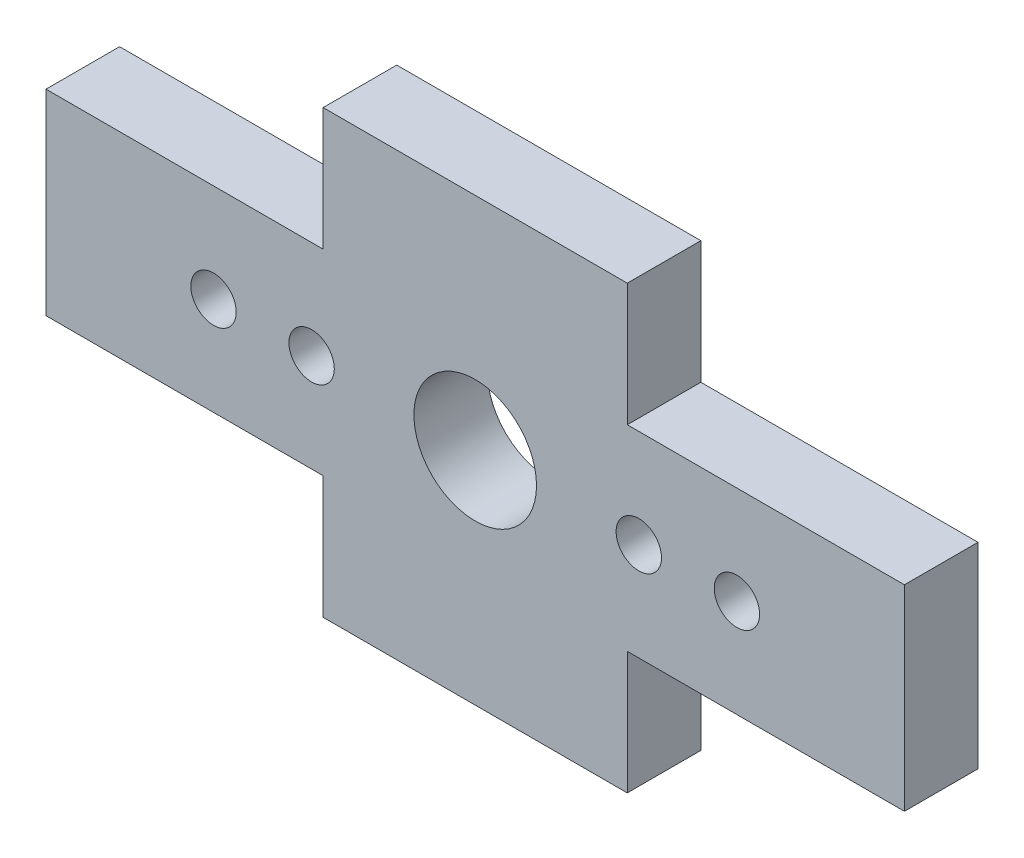
ISO-10303-21;
HEADER;
FILE_DESCRIPTION(('STEP AP214'),'2;1');
FILE_NAME('part.step','',(''),(''),'','','');
FILE_SCHEMA(('AUTOMOTIVE_DESIGN { 1 0 10303 214 1 1 1 1 }'));
ENDSEC;
DATA;
#1=APPLICATION_CONTEXT('core data for automotive mechanical design processes');
#2=APPLICATION_PROTOCOL_DEFINITION('international standard','automotive_design',2000,#1);
#3=PRODUCT_CONTEXT('',#1,'mechanical');
#4=PRODUCT('Part','Part','',(#3));
#5=PRODUCT_RELATED_PRODUCT_CATEGORY('part','',(#4));
#6=PRODUCT_DEFINITION_FORMATION('','',#4);
#7=PRODUCT_DEFINITION_CONTEXT('part definition',#1,'design');
#8=PRODUCT_DEFINITION('design','',#6,#7);
#9=PRODUCT_DEFINITION_SHAPE('','',#8);
#10=(LENGTH_UNIT() NAMED_UNIT(*) SI_UNIT(.MILLI.,.METRE.));
#11=(NAMED_UNIT(*) PLANE_ANGLE_UNIT() SI_UNIT($,.RADIAN.));
#12=(NAMED_UNIT(*) SI_UNIT($,.STERADIAN.) SOLID_ANGLE_UNIT());
#13=UNCERTAINTY_MEASURE_WITH_UNIT(LENGTH_MEASURE(1.E-05),#10,'distance_accuracy_value','');
#14=(GEOMETRIC_REPRESENTATION_CONTEXT(3) GLOBAL_UNCERTAINTY_ASSIGNED_CONTEXT((#13)) GLOBAL_UNIT_ASSIGNED_CONTEXT((#10,
#11,#12)) REPRESENTATION_CONTEXT('',''));
#15=CARTESIAN_POINT('',(0.,0.,0.));
#16=DIRECTION('',(0.,0.,1.));
#17=DIRECTION('',(1.,0.,0.));
#18=AXIS2_PLACEMENT_3D('',#15,#16,#17);
#19=CARTESIAN_POINT('',(0.,0.,3.));
#20=DIRECTION('',(0.,0.,1.));
#21=DIRECTION('',(1.,0.,0.));
#22=AXIS2_PLACEMENT_3D('',#19,#20,#21);
#23=PLANE('',#22);
#24=CARTESIAN_POINT('',(-6.66999999999978,0.,3.));
#25=DIRECTION('',(0.,0.,1.));
#26=DIRECTION('',(1.,0.,0.));
#27=AXIS2_PLACEMENT_3D('',#24,#25,#26);
#28=CIRCLE('',#27,0.925000000000065);
#29=CARTESIAN_POINT('',(-5.74499999999971,0.,3.));
#30=VERTEX_POINT('',#29);
#31=EDGE_CURVE('E294',#30,#30,#28,.T.);
#32=ORIENTED_EDGE('',*,*,#31,.F.);
#33=EDGE_LOOP('',(#32));
#34=FACE_BOUND('',#33,.T.);
#35=CARTESIAN_POINT('',(6.67000000000022,0.,3.));
#36=DIRECTION('',(0.,0.,1.));
#37=DIRECTION('',(1.,0.,0.));
#38=AXIS2_PLACEMENT_3D('',#35,#36,#37);
#39=CIRCLE('',#38,0.925000000000065);
#40=CARTESIAN_POINT('',(7.59500000000029,0.,3.));
#41=VERTEX_POINT('',#40);
#42=EDGE_CURVE('E306',#41,#41,#39,.T.);
#43=ORIENTED_EDGE('',*,*,#42,.F.);
#44=EDGE_LOOP('',(#43));
#45=FACE_BOUND('',#44,.T.);
#46=DIRECTION('',(-1.,0.,0.));
#47=VECTOR('',#46,1.);
#48=CARTESIAN_POINT('',(-17.4999999999999,4.,3.));
#49=LINE('',#48,#47);
#50=CARTESIAN_POINT('',(-6.20000000000021,4.,3.));
#51=VERTEX_POINT('',#50);
#52=CARTESIAN_POINT('',(-17.4999999999999,4.,3.));
#53=VERTEX_POINT('',#52);
#54=EDGE_CURVE('E176',#51,#53,#49,.T.);
#55=ORIENTED_EDGE('',*,*,#54,.T.);
#56=DIRECTION('',(0.,-1.,0.));
#57=VECTOR('',#56,1.);
#58=CARTESIAN_POINT('',(-17.4999999999999,-4.00000000000001,3.));
#59=LINE('',#58,#57);
#60=CARTESIAN_POINT('',(-17.4999999999999,-4.00000000000001,3.));
#61=VERTEX_POINT('',#60);
#62=EDGE_CURVE('E104',#53,#61,#59,.T.);
#63=ORIENTED_EDGE('',*,*,#62,.T.);
#64=DIRECTION('',(1.,0.,0.));
#65=VECTOR('',#64,1.);
#66=CARTESIAN_POINT('',(-6.20000000000021,-4.,3.));
#67=LINE('',#66,#65);
#68=CARTESIAN_POINT('',(-6.20000000000021,-4.,3.));
#69=VERTEX_POINT('',#68);
#70=EDGE_CURVE('E203',#61,#69,#67,.T.);
#71=ORIENTED_EDGE('',*,*,#70,.T.);
#72=DIRECTION('',(0.,-1.,0.));
#73=VECTOR('',#72,1.);
#74=CARTESIAN_POINT('',(-6.20000000000021,-4.,3.));
#75=LINE('',#74,#73);
#76=CARTESIAN_POINT('',(-6.2000000000002,-9.00000000000001,3.));
#77=VERTEX_POINT('',#76);
#78=EDGE_CURVE('E222',#69,#77,#75,.T.);
#79=ORIENTED_EDGE('',*,*,#78,.T.);
#80=DIRECTION('',(1.,0.,0.));
#81=VECTOR('',#80,1.);
#82=CARTESIAN_POINT('',(-6.2000000000002,-9.00000000000001,3.));
#83=LINE('',#82,#81);
#84=CARTESIAN_POINT('',(6.20000000000043,-9.00000000000001,3.));
#85=VERTEX_POINT('',#84);
#86=EDGE_CURVE('E219',#77,#85,#83,.T.);
#87=ORIENTED_EDGE('',*,*,#86,.T.);
#88=DIRECTION('',(0.,1.,0.));
#89=VECTOR('',#88,1.);
#90=CARTESIAN_POINT('',(6.20000000000043,-4.,3.));
#91=LINE('',#90,#89);
#92=CARTESIAN_POINT('',(6.20000000000043,-4.,3.));
#93=VERTEX_POINT('',#92);
#94=EDGE_CURVE('E221',#85,#93,#91,.T.);
#95=ORIENTED_EDGE('',*,*,#94,.T.);
#96=DIRECTION('',(1.,0.,0.));
#97=VECTOR('',#96,1.);
#98=CARTESIAN_POINT('',(17.5000000000001,-4.,3.));
#99=LINE('',#98,#97);
#100=CARTESIAN_POINT('',(17.5000000000001,-4.,3.));
#101=VERTEX_POINT('',#100);
#102=EDGE_CURVE('E224',#93,#101,#99,.T.);
#103=ORIENTED_EDGE('',*,*,#102,.T.);
#104=DIRECTION('',(0.,1.,0.));
#105=VECTOR('',#104,1.);
#106=CARTESIAN_POINT('',(17.5000000000001,4.,3.));
#107=LINE('',#106,#105);
#108=CARTESIAN_POINT('',(17.5000000000001,4.,3.));
#109=VERTEX_POINT('',#108);
#110=EDGE_CURVE('E230',#101,#109,#107,.T.);
#111=ORIENTED_EDGE('',*,*,#110,.T.);
#112=DIRECTION('',(-1.,0.,0.));
#113=VECTOR('',#112,1.);
#114=CARTESIAN_POINT('',(6.20000000000043,4.,3.));
#115=LINE('',#114,#113);
#116=CARTESIAN_POINT('',(6.20000000000043,4.,3.));
#117=VERTEX_POINT('',#116);
#118=EDGE_CURVE('E135',#109,#117,#115,.T.);
#119=ORIENTED_EDGE('',*,*,#118,.T.);
#120=DIRECTION('',(0.,1.,0.));
#121=VECTOR('',#120,1.);
#122=CARTESIAN_POINT('',(6.20000000000043,4.,3.));
#123=LINE('',#122,#121);
#124=CARTESIAN_POINT('',(6.20000000000043,9.00000000000001,3.));
#125=VERTEX_POINT('',#124);
#126=EDGE_CURVE('E129',#117,#125,#123,.T.);
#127=ORIENTED_EDGE('',*,*,#126,.T.);
#128=DIRECTION('',(-1.,0.,0.));
#129=VECTOR('',#128,1.);
#130=CARTESIAN_POINT('',(-6.20000000000021,9.00000000000001,3.));
#131=LINE('',#130,#129);
#132=CARTESIAN_POINT('',(-6.20000000000021,9.00000000000001,3.));
#133=VERTEX_POINT('',#132);
#134=EDGE_CURVE('E133',#125,#133,#131,.T.);
#135=ORIENTED_EDGE('',*,*,#134,.T.);
#136=DIRECTION('',(0.,-1.,0.));
#137=VECTOR('',#136,1.);
#138=CARTESIAN_POINT('',(-6.20000000000021,4.,3.));
#139=LINE('',#138,#137);
#140=EDGE_CURVE('E49',#133,#51,#139,.T.);
#141=ORIENTED_EDGE('',*,*,#140,.T.);
#142=EDGE_LOOP('',(#55,#63,#71,#79,#87,#95,#103,#111,#119,#127,#135,#141));
#143=FACE_BOUND('',#142,.T.);
#144=CARTESIAN_POINT('',(2.22044604925031E-13,0.,3.));
#145=DIRECTION('',(0.,0.,1.));
#146=DIRECTION('',(1.,0.,0.));
#147=AXIS2_PLACEMENT_3D('',#144,#145,#146);
#148=CIRCLE('',#147,2.49999999999995);
#149=CARTESIAN_POINT('',(2.50000000000017,0.,3.));
#150=VERTEX_POINT('',#149);
#151=EDGE_CURVE('E157',#150,#150,#148,.T.);
#152=ORIENTED_EDGE('',*,*,#151,.F.);
#153=EDGE_LOOP('',(#152));
#154=FACE_BOUND('',#153,.T.);
#155=CARTESIAN_POINT('',(10.6700000000002,0.,3.));
#156=DIRECTION('',(0.,0.,1.));
#157=DIRECTION('',(1.,0.,0.));
#158=AXIS2_PLACEMENT_3D('',#155,#156,#157);
#159=CIRCLE('',#158,0.925000000000064);
#160=CARTESIAN_POINT('',(11.5950000000003,0.,3.));
#161=VERTEX_POINT('',#160);
#162=EDGE_CURVE('E300',#161,#161,#159,.T.);
#163=ORIENTED_EDGE('',*,*,#162,.F.);
#164=EDGE_LOOP('',(#163));
#165=FACE_BOUND('',#164,.T.);
#166=CARTESIAN_POINT('',(-10.6699999999998,0.,3.));
#167=DIRECTION('',(0.,0.,1.));
#168=DIRECTION('',(1.,0.,0.));
#169=AXIS2_PLACEMENT_3D('',#166,#167,#168);
#170=CIRCLE('',#169,0.925000000000064);
#171=CARTESIAN_POINT('',(-9.74499999999971,0.,3.));
#172=VERTEX_POINT('',#171);
#173=EDGE_CURVE('E285',#172,#172,#170,.T.);
#174=ORIENTED_EDGE('',*,*,#173,.F.);
#175=EDGE_LOOP('',(#174));
#176=FACE_BOUND('',#175,.T.);
#177=ADVANCED_FACE('F32',(#34,#45,#143,#154,#165,#176),#23,.T.);
#178=CARTESIAN_POINT('',(0.,0.,0.));
#179=DIRECTION('',(0.,0.,1.));
#180=DIRECTION('',(1.,0.,0.));
#181=AXIS2_PLACEMENT_3D('',#178,#179,#180);
#182=PLANE('',#181);
#183=DIRECTION('',(-1.,0.,0.));
#184=VECTOR('',#183,1.);
#185=CARTESIAN_POINT('',(-17.4999999999999,4.,0.));
#186=LINE('',#185,#184);
#187=CARTESIAN_POINT('',(-6.20000000000021,4.,0.));
#188=VERTEX_POINT('',#187);
#189=CARTESIAN_POINT('',(-17.4999999999999,4.,0.));
#190=VERTEX_POINT('',#189);
#191=EDGE_CURVE('E153',#188,#190,#186,.T.);
#192=ORIENTED_EDGE('',*,*,#191,.F.);
#193=DIRECTION('',(0.,-1.,0.));
#194=VECTOR('',#193,1.);
#195=CARTESIAN_POINT('',(-6.20000000000021,4.,0.));
#196=LINE('',#195,#194);
#197=CARTESIAN_POINT('',(-6.20000000000021,9.00000000000001,0.));
#198=VERTEX_POINT('',#197);
#199=EDGE_CURVE('E96',#198,#188,#196,.T.);
#200=ORIENTED_EDGE('',*,*,#199,.F.);
#201=DIRECTION('',(-1.,0.,0.));
#202=VECTOR('',#201,1.);
#203=CARTESIAN_POINT('',(-6.20000000000021,9.00000000000001,0.));
#204=LINE('',#203,#202);
#205=CARTESIAN_POINT('',(6.20000000000043,9.00000000000001,0.));
#206=VERTEX_POINT('',#205);
#207=EDGE_CURVE('E90',#206,#198,#204,.T.);
#208=ORIENTED_EDGE('',*,*,#207,.F.);
#209=DIRECTION('',(0.,1.,0.));
#210=VECTOR('',#209,1.);
#211=CARTESIAN_POINT('',(6.20000000000043,4.,0.));
#212=LINE('',#211,#210);
#213=CARTESIAN_POINT('',(6.20000000000043,4.,0.));
#214=VERTEX_POINT('',#213);
#215=EDGE_CURVE('E143',#214,#206,#212,.T.);
#216=ORIENTED_EDGE('',*,*,#215,.F.);
#217=DIRECTION('',(-1.,0.,0.));
#218=VECTOR('',#217,1.);
#219=CARTESIAN_POINT('',(6.20000000000043,4.,0.));
#220=LINE('',#219,#218);
#221=CARTESIAN_POINT('',(17.5000000000001,4.,0.));
#222=VERTEX_POINT('',#221);
#223=EDGE_CURVE('E171',#222,#214,#220,.T.);
#224=ORIENTED_EDGE('',*,*,#223,.F.);
#225=DIRECTION('',(0.,1.,0.));
#226=VECTOR('',#225,1.);
#227=CARTESIAN_POINT('',(17.5000000000001,4.,0.));
#228=LINE('',#227,#226);
#229=CARTESIAN_POINT('',(17.5000000000001,-4.,0.));
#230=VERTEX_POINT('',#229);
#231=EDGE_CURVE('E169',#230,#222,#228,.T.);
#232=ORIENTED_EDGE('',*,*,#231,.F.);
#233=DIRECTION('',(1.,0.,0.));
#234=VECTOR('',#233,1.);
#235=CARTESIAN_POINT('',(17.5000000000001,-4.,0.));
#236=LINE('',#235,#234);
#237=CARTESIAN_POINT('',(6.20000000000043,-4.,0.));
#238=VERTEX_POINT('',#237);
#239=EDGE_CURVE('E167',#238,#230,#236,.T.);
#240=ORIENTED_EDGE('',*,*,#239,.F.);
#241=DIRECTION('',(0.,1.,0.));
#242=VECTOR('',#241,1.);
#243=CARTESIAN_POINT('',(6.20000000000043,-4.,0.));
#244=LINE('',#243,#242);
#245=CARTESIAN_POINT('',(6.20000000000043,-9.00000000000001,0.));
#246=VERTEX_POINT('',#245);
#247=EDGE_CURVE('E165',#246,#238,#244,.T.);
#248=ORIENTED_EDGE('',*,*,#247,.F.);
#249=DIRECTION('',(1.,0.,0.));
#250=VECTOR('',#249,1.);
#251=CARTESIAN_POINT('',(-6.2000000000002,-9.00000000000001,0.));
#252=LINE('',#251,#250);
#253=CARTESIAN_POINT('',(-6.2000000000002,-9.00000000000001,0.));
#254=VERTEX_POINT('',#253);
#255=EDGE_CURVE('E163',#254,#246,#252,.T.);
#256=ORIENTED_EDGE('',*,*,#255,.F.);
#257=DIRECTION('',(0.,-1.,0.));
#258=VECTOR('',#257,1.);
#259=CARTESIAN_POINT('',(-6.20000000000021,-4.,0.));
#260=LINE('',#259,#258);
#261=CARTESIAN_POINT('',(-6.20000000000021,-4.,0.));
#262=VERTEX_POINT('',#261);
#263=EDGE_CURVE('E161',#262,#254,#260,.T.);
#264=ORIENTED_EDGE('',*,*,#263,.F.);
#265=DIRECTION('',(1.,0.,0.));
#266=VECTOR('',#265,1.);
#267=CARTESIAN_POINT('',(-6.20000000000021,-4.,0.));
#268=LINE('',#267,#266);
#269=CARTESIAN_POINT('',(-17.4999999999999,-4.00000000000001,0.));
#270=VERTEX_POINT('',#269);
#271=EDGE_CURVE('E159',#270,#262,#268,.T.);
#272=ORIENTED_EDGE('',*,*,#271,.F.);
#273=DIRECTION('',(0.,-1.,0.));
#274=VECTOR('',#273,1.);
#275=CARTESIAN_POINT('',(-17.4999999999999,-4.00000000000001,0.));
#276=LINE('',#275,#274);
#277=EDGE_CURVE('E156',#190,#270,#276,.T.);
#278=ORIENTED_EDGE('',*,*,#277,.F.);
#279=EDGE_LOOP('',(#192,#200,#208,#216,#224,#232,#240,#248,#256,#264,#272,#278));
#280=FACE_BOUND('',#279,.T.);
#281=CARTESIAN_POINT('',(2.22044604925031E-13,0.,0.));
#282=DIRECTION('',(0.,0.,1.));
#283=DIRECTION('',(1.,0.,0.));
#284=AXIS2_PLACEMENT_3D('',#281,#282,#283);
#285=CIRCLE('',#284,2.49999999999995);
#286=CARTESIAN_POINT('',(2.50000000000017,0.,0.));
#287=VERTEX_POINT('',#286);
#288=EDGE_CURVE('E309',#287,#287,#285,.T.);
#289=ORIENTED_EDGE('',*,*,#288,.T.);
#290=EDGE_LOOP('',(#289));
#291=FACE_BOUND('',#290,.T.);
#292=CARTESIAN_POINT('',(6.67000000000022,0.,0.));
#293=DIRECTION('',(0.,0.,1.));
#294=DIRECTION('',(1.,0.,0.));
#295=AXIS2_PLACEMENT_3D('',#292,#293,#294);
#296=CIRCLE('',#295,0.925000000000065);
#297=CARTESIAN_POINT('',(7.59500000000029,0.,0.));
#298=VERTEX_POINT('',#297);
#299=EDGE_CURVE('E303',#298,#298,#296,.T.);
#300=ORIENTED_EDGE('',*,*,#299,.T.);
#301=EDGE_LOOP('',(#300));
#302=FACE_BOUND('',#301,.T.);
#303=CARTESIAN_POINT('',(10.6700000000002,0.,0.));
#304=DIRECTION('',(0.,0.,1.));
#305=DIRECTION('',(1.,0.,0.));
#306=AXIS2_PLACEMENT_3D('',#303,#304,#305);
#307=CIRCLE('',#306,0.925000000000064);
#308=CARTESIAN_POINT('',(11.5950000000003,0.,0.));
#309=VERTEX_POINT('',#308);
#310=EDGE_CURVE('E297',#309,#309,#307,.T.);
#311=ORIENTED_EDGE('',*,*,#310,.T.);
#312=EDGE_LOOP('',(#311));
#313=FACE_BOUND('',#312,.T.);
#314=CARTESIAN_POINT('',(-6.66999999999978,0.,0.));
#315=DIRECTION('',(0.,0.,1.));
#316=DIRECTION('',(1.,0.,0.));
#317=AXIS2_PLACEMENT_3D('',#314,#315,#316);
#318=CIRCLE('',#317,0.925000000000065);
#319=CARTESIAN_POINT('',(-5.74499999999971,0.,0.));
#320=VERTEX_POINT('',#319);
#321=EDGE_CURVE('E291',#320,#320,#318,.T.);
#322=ORIENTED_EDGE('',*,*,#321,.T.);
#323=EDGE_LOOP('',(#322));
#324=FACE_BOUND('',#323,.T.);
#325=CARTESIAN_POINT('',(-10.6699999999998,0.,0.));
#326=DIRECTION('',(0.,0.,1.));
#327=DIRECTION('',(1.,0.,0.));
#328=AXIS2_PLACEMENT_3D('',#325,#326,#327);
#329=CIRCLE('',#328,0.925000000000064);
#330=CARTESIAN_POINT('',(-9.74499999999971,0.,0.));
#331=VERTEX_POINT('',#330);
#332=EDGE_CURVE('E288',#331,#331,#329,.T.);
#333=ORIENTED_EDGE('',*,*,#332,.T.);
#334=EDGE_LOOP('',(#333));
#335=FACE_BOUND('',#334,.T.);
#336=ADVANCED_FACE('F207',(#280,#291,#302,#313,#324,#335),#182,.F.);
#337=CARTESIAN_POINT('',(-17.4999999999999,4.,3.));
#338=DIRECTION('',(0.,-1.,0.));
#339=DIRECTION('',(1.,0.,0.));
#340=AXIS2_PLACEMENT_3D('',#337,#338,#339);
#341=PLANE('',#340);
#342=ORIENTED_EDGE('',*,*,#191,.T.);
#343=DIRECTION('',(0.,0.,-1.));
#344=VECTOR('',#343,1.);
#345=CARTESIAN_POINT('',(-17.4999999999999,4.,3.));
#346=LINE('',#345,#344);
#347=EDGE_CURVE('E11',#53,#190,#346,.T.);
#348=ORIENTED_EDGE('',*,*,#347,.F.);
#349=ORIENTED_EDGE('',*,*,#54,.F.);
#350=DIRECTION('',(0.,0.,-1.));
#351=VECTOR('',#350,1.);
#352=CARTESIAN_POINT('',(-6.20000000000021,4.,3.));
#353=LINE('',#352,#351);
#354=EDGE_CURVE('E149',#51,#188,#353,.T.);
#355=ORIENTED_EDGE('',*,*,#354,.T.);
#356=EDGE_LOOP('',(#342,#348,#349,#355));
#357=FACE_BOUND('',#356,.T.);
#358=ADVANCED_FACE('F34',(#357),#341,.F.);
#359=CARTESIAN_POINT('',(-17.4999999999999,-4.00000000000001,3.));
#360=DIRECTION('',(1.,0.,0.));
#361=DIRECTION('',(0.,0.,-1.));
#362=AXIS2_PLACEMENT_3D('',#359,#360,#361);
#363=PLANE('',#362);
#364=ORIENTED_EDGE('',*,*,#277,.T.);
#365=DIRECTION('',(0.,0.,-1.));
#366=VECTOR('',#365,1.);
#367=CARTESIAN_POINT('',(-17.4999999999999,-4.00000000000001,3.));
#368=LINE('',#367,#366);
#369=EDGE_CURVE('E41',#61,#270,#368,.T.);
#370=ORIENTED_EDGE('',*,*,#369,.F.);
#371=ORIENTED_EDGE('',*,*,#62,.F.);
#372=ORIENTED_EDGE('',*,*,#347,.T.);
#373=EDGE_LOOP('',(#364,#370,#371,#372));
#374=FACE_BOUND('',#373,.T.);
#375=ADVANCED_FACE('F428',(#374),#363,.F.);
#376=CARTESIAN_POINT('',(-6.20000000000021,-4.,3.));
#377=DIRECTION('',(0.,1.,0.));
#378=DIRECTION('',(-1.,0.,0.));
#379=AXIS2_PLACEMENT_3D('',#376,#377,#378);
#380=PLANE('',#379);
#381=ORIENTED_EDGE('',*,*,#271,.T.);
#382=DIRECTION('',(0.,0.,-1.));
#383=VECTOR('',#382,1.);
#384=CARTESIAN_POINT('',(-6.20000000000021,-4.,3.));
#385=LINE('',#384,#383);
#386=EDGE_CURVE('E195',#69,#262,#385,.T.);
#387=ORIENTED_EDGE('',*,*,#386,.F.);
#388=ORIENTED_EDGE('',*,*,#70,.F.);
#389=ORIENTED_EDGE('',*,*,#369,.T.);
#390=EDGE_LOOP('',(#381,#387,#388,#389));
#391=FACE_BOUND('',#390,.T.);
#392=ADVANCED_FACE('F201',(#391),#380,.F.);
#393=CARTESIAN_POINT('',(-6.20000000000021,-4.,3.));
#394=DIRECTION('',(1.,0.,0.));
#395=DIRECTION('',(0.,1.,0.));
#396=AXIS2_PLACEMENT_3D('',#393,#394,#395);
#397=PLANE('',#396);
#398=ORIENTED_EDGE('',*,*,#263,.T.);
#399=DIRECTION('',(0.,0.,-1.));
#400=VECTOR('',#399,1.);
#401=CARTESIAN_POINT('',(-6.2000000000002,-9.00000000000001,3.));
#402=LINE('',#401,#400);
#403=EDGE_CURVE('E192',#77,#254,#402,.T.);
#404=ORIENTED_EDGE('',*,*,#403,.F.);
#405=ORIENTED_EDGE('',*,*,#78,.F.);
#406=ORIENTED_EDGE('',*,*,#386,.T.);
#407=EDGE_LOOP('',(#398,#404,#405,#406));
#408=FACE_BOUND('',#407,.T.);
#409=ADVANCED_FACE('F213',(#408),#397,.F.);
#410=CARTESIAN_POINT('',(-6.2000000000002,-9.00000000000001,3.));
#411=DIRECTION('',(0.,1.,0.));
#412=DIRECTION('',(0.,0.,1.));
#413=AXIS2_PLACEMENT_3D('',#410,#411,#412);
#414=PLANE('',#413);
#415=ORIENTED_EDGE('',*,*,#255,.T.);
#416=DIRECTION('',(0.,0.,-1.));
#417=VECTOR('',#416,1.);
#418=CARTESIAN_POINT('',(6.20000000000043,-9.00000000000001,3.));
#419=LINE('',#418,#417);
#420=EDGE_CURVE('E189',#85,#246,#419,.T.);
#421=ORIENTED_EDGE('',*,*,#420,.F.);
#422=ORIENTED_EDGE('',*,*,#86,.F.);
#423=ORIENTED_EDGE('',*,*,#403,.T.);
#424=EDGE_LOOP('',(#415,#421,#422,#423));
#425=FACE_BOUND('',#424,.T.);
#426=ADVANCED_FACE('F217',(#425),#414,.F.);
#427=CARTESIAN_POINT('',(6.20000000000043,-4.,3.));
#428=DIRECTION('',(-1.,0.,0.));
#429=DIRECTION('',(0.,0.,1.));
#430=AXIS2_PLACEMENT_3D('',#427,#428,#429);
#431=PLANE('',#430);
#432=ORIENTED_EDGE('',*,*,#247,.T.);
#433=DIRECTION('',(0.,0.,-1.));
#434=VECTOR('',#433,1.);
#435=CARTESIAN_POINT('',(6.20000000000043,-4.,3.));
#436=LINE('',#435,#434);
#437=EDGE_CURVE('E186',#93,#238,#436,.T.);
#438=ORIENTED_EDGE('',*,*,#437,.F.);
#439=ORIENTED_EDGE('',*,*,#94,.F.);
#440=ORIENTED_EDGE('',*,*,#420,.T.);
#441=EDGE_LOOP('',(#432,#438,#439,#440));
#442=FACE_BOUND('',#441,.T.);
#443=ADVANCED_FACE('F393',(#442),#431,.F.);
#444=CARTESIAN_POINT('',(17.5000000000001,-4.,3.));
#445=DIRECTION('',(0.,1.,0.));
#446=DIRECTION('',(-1.,0.,0.));
#447=AXIS2_PLACEMENT_3D('',#444,#445,#446);
#448=PLANE('',#447);
#449=ORIENTED_EDGE('',*,*,#239,.T.);
#450=DIRECTION('',(0.,0.,-1.));
#451=VECTOR('',#450,1.);
#452=CARTESIAN_POINT('',(17.5000000000001,-4.,3.));
#453=LINE('',#452,#451);
#454=EDGE_CURVE('E183',#101,#230,#453,.T.);
#455=ORIENTED_EDGE('',*,*,#454,.F.);
#456=ORIENTED_EDGE('',*,*,#102,.F.);
#457=ORIENTED_EDGE('',*,*,#437,.T.);
#458=EDGE_LOOP('',(#449,#455,#456,#457));
#459=FACE_BOUND('',#458,.T.);
#460=ADVANCED_FACE('F384',(#459),#448,.F.);
#461=CARTESIAN_POINT('',(17.5000000000001,4.,3.));
#462=DIRECTION('',(-1.,0.,0.));
#463=DIRECTION('',(0.,0.,1.));
#464=AXIS2_PLACEMENT_3D('',#461,#462,#463);
#465=PLANE('',#464);
#466=ORIENTED_EDGE('',*,*,#231,.T.);
#467=DIRECTION('',(0.,0.,-1.));
#468=VECTOR('',#467,1.);
#469=CARTESIAN_POINT('',(17.5000000000001,4.,3.));
#470=LINE('',#469,#468);
#471=EDGE_CURVE('E180',#109,#222,#470,.T.);
#472=ORIENTED_EDGE('',*,*,#471,.F.);
#473=ORIENTED_EDGE('',*,*,#110,.F.);
#474=ORIENTED_EDGE('',*,*,#454,.T.);
#475=EDGE_LOOP('',(#466,#472,#473,#474));
#476=FACE_BOUND('',#475,.T.);
#477=ADVANCED_FACE('F236',(#476),#465,.F.);
#478=CARTESIAN_POINT('',(6.20000000000043,4.,3.));
#479=DIRECTION('',(0.,-1.,0.));
#480=DIRECTION('',(1.,0.,0.));
#481=AXIS2_PLACEMENT_3D('',#478,#479,#480);
#482=PLANE('',#481);
#483=ORIENTED_EDGE('',*,*,#223,.T.);
#484=DIRECTION('',(0.,0.,-1.));
#485=VECTOR('',#484,1.);
#486=CARTESIAN_POINT('',(6.20000000000043,4.,3.));
#487=LINE('',#486,#485);
#488=EDGE_CURVE('E144',#117,#214,#487,.T.);
#489=ORIENTED_EDGE('',*,*,#488,.F.);
#490=ORIENTED_EDGE('',*,*,#118,.F.);
#491=ORIENTED_EDGE('',*,*,#471,.T.);
#492=EDGE_LOOP('',(#483,#489,#490,#491));
#493=FACE_BOUND('',#492,.T.);
#494=ADVANCED_FACE('F240',(#493),#482,.F.);
#495=CARTESIAN_POINT('',(6.20000000000043,4.,3.));
#496=DIRECTION('',(-1.,0.,0.));
#497=DIRECTION('',(0.,0.,1.));
#498=AXIS2_PLACEMENT_3D('',#495,#496,#497);
#499=PLANE('',#498);
#500=ORIENTED_EDGE('',*,*,#215,.T.);
#501=DIRECTION('',(0.,0.,-1.));
#502=VECTOR('',#501,1.);
#503=CARTESIAN_POINT('',(6.20000000000043,9.00000000000001,3.));
#504=LINE('',#503,#502);
#505=EDGE_CURVE('E140',#125,#206,#504,.T.);
#506=ORIENTED_EDGE('',*,*,#505,.F.);
#507=ORIENTED_EDGE('',*,*,#126,.F.);
#508=ORIENTED_EDGE('',*,*,#488,.T.);
#509=EDGE_LOOP('',(#500,#506,#507,#508));
#510=FACE_BOUND('',#509,.T.);
#511=ADVANCED_FACE('F141',(#510),#499,.F.);
#512=CARTESIAN_POINT('',(-6.20000000000021,9.00000000000001,3.));
#513=DIRECTION('',(0.,-1.,0.));
#514=DIRECTION('',(0.,0.,-1.));
#515=AXIS2_PLACEMENT_3D('',#512,#513,#514);
#516=PLANE('',#515);
#517=ORIENTED_EDGE('',*,*,#207,.T.);
#518=DIRECTION('',(0.,0.,-1.));
#519=VECTOR('',#518,1.);
#520=CARTESIAN_POINT('',(-6.20000000000021,9.00000000000001,3.));
#521=LINE('',#520,#519);
#522=EDGE_CURVE('E145',#133,#198,#521,.T.);
#523=ORIENTED_EDGE('',*,*,#522,.F.);
#524=ORIENTED_EDGE('',*,*,#134,.F.);
#525=ORIENTED_EDGE('',*,*,#505,.T.);
#526=EDGE_LOOP('',(#517,#523,#524,#525));
#527=FACE_BOUND('',#526,.T.);
#528=ADVANCED_FACE('F147',(#527),#516,.F.);
#529=CARTESIAN_POINT('',(-6.20000000000021,4.,3.));
#530=DIRECTION('',(1.,0.,0.));
#531=DIRECTION('',(0.,0.,-1.));
#532=AXIS2_PLACEMENT_3D('',#529,#530,#531);
#533=PLANE('',#532);
#534=ORIENTED_EDGE('',*,*,#199,.T.);
#535=ORIENTED_EDGE('',*,*,#354,.F.);
#536=ORIENTED_EDGE('',*,*,#140,.F.);
#537=ORIENTED_EDGE('',*,*,#522,.T.);
#538=EDGE_LOOP('',(#534,#535,#536,#537));
#539=FACE_BOUND('',#538,.T.);
#540=ADVANCED_FACE('F244',(#539),#533,.F.);
#541=CARTESIAN_POINT('',(2.22044604925031E-13,0.,3.));
#542=DIRECTION('',(0.,0.,-1.));
#543=DIRECTION('',(-1.,0.,0.));
#544=AXIS2_PLACEMENT_3D('',#541,#542,#543);
#545=CYLINDRICAL_SURFACE('',#544,2.49999999999995);
#546=ORIENTED_EDGE('',*,*,#151,.T.);
#547=EDGE_LOOP('',(#546));
#548=FACE_BOUND('',#547,.T.);
#549=ORIENTED_EDGE('',*,*,#288,.F.);
#550=EDGE_LOOP('',(#549));
#551=FACE_BOUND('',#550,.T.);
#552=ADVANCED_FACE('F246',(#548,#551),#545,.F.);
#553=CARTESIAN_POINT('',(6.67000000000022,0.,3.));
#554=DIRECTION('',(0.,0.,-1.));
#555=DIRECTION('',(-1.,0.,0.));
#556=AXIS2_PLACEMENT_3D('',#553,#554,#555);
#557=CYLINDRICAL_SURFACE('',#556,0.925000000000065);
#558=ORIENTED_EDGE('',*,*,#42,.T.);
#559=EDGE_LOOP('',(#558));
#560=FACE_BOUND('',#559,.T.);
#561=ORIENTED_EDGE('',*,*,#299,.F.);
#562=EDGE_LOOP('',(#561));
#563=FACE_BOUND('',#562,.T.);
#564=ADVANCED_FACE('F252',(#560,#563),#557,.F.);
#565=CARTESIAN_POINT('',(10.6700000000002,0.,3.));
#566=DIRECTION('',(0.,0.,-1.));
#567=DIRECTION('',(-1.,0.,0.));
#568=AXIS2_PLACEMENT_3D('',#565,#566,#567);
#569=CYLINDRICAL_SURFACE('',#568,0.925000000000064);
#570=ORIENTED_EDGE('',*,*,#162,.T.);
#571=EDGE_LOOP('',(#570));
#572=FACE_BOUND('',#571,.T.);
#573=ORIENTED_EDGE('',*,*,#310,.F.);
#574=EDGE_LOOP('',(#573));
#575=FACE_BOUND('',#574,.T.);
#576=ADVANCED_FACE('F268',(#572,#575),#569,.F.);
#577=CARTESIAN_POINT('',(-6.66999999999978,0.,3.));
#578=DIRECTION('',(0.,0.,-1.));
#579=DIRECTION('',(-1.,0.,0.));
#580=AXIS2_PLACEMENT_3D('',#577,#578,#579);
#581=CYLINDRICAL_SURFACE('',#580,0.925000000000065);
#582=ORIENTED_EDGE('',*,*,#31,.T.);
#583=EDGE_LOOP('',(#582));
#584=FACE_BOUND('',#583,.T.);
#585=ORIENTED_EDGE('',*,*,#321,.F.);
#586=EDGE_LOOP('',(#585));
#587=FACE_BOUND('',#586,.T.);
#588=ADVANCED_FACE('F272',(#584,#587),#581,.F.);
#589=CARTESIAN_POINT('',(-10.6699999999998,0.,3.));
#590=DIRECTION('',(0.,0.,-1.));
#591=DIRECTION('',(-1.,0.,0.));
#592=AXIS2_PLACEMENT_3D('',#589,#590,#591);
#593=CYLINDRICAL_SURFACE('',#592,0.925000000000064);
#594=ORIENTED_EDGE('',*,*,#173,.T.);
#595=EDGE_LOOP('',(#594));
#596=FACE_BOUND('',#595,.T.);
#597=ORIENTED_EDGE('',*,*,#332,.F.);
#598=EDGE_LOOP('',(#597));
#599=FACE_BOUND('',#598,.T.);
#600=ADVANCED_FACE('F276',(#596,#599),#593,.F.);
#601=CLOSED_SHELL('',(#177,#336,#358,#375,#392,#409,#426,#443,#460,#477,#494,#511,#528,#540,
#552,#564,#576,#588,#600));
#602=MANIFOLD_SOLID_BREP('B2',#601);
#603=ADVANCED_BREP_SHAPE_REPRESENTATION('',(#18,#602),#14);
#604=SHAPE_DEFINITION_REPRESENTATION(#9,#603);
ENDSEC;
END-ISO-10303-21;
